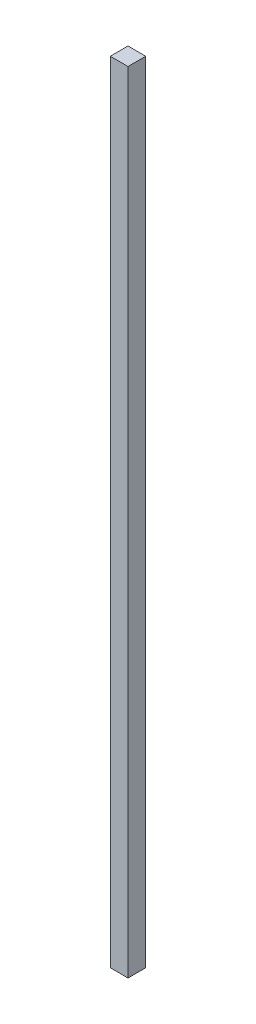
ISO-10303-21;
HEADER;
FILE_DESCRIPTION(('STEP AP214'),'2;1');
FILE_NAME('part.step','',(''),(''),'','','');
FILE_SCHEMA(('AUTOMOTIVE_DESIGN { 1 0 10303 214 1 1 1 1 }'));
ENDSEC;
DATA;
#1=APPLICATION_CONTEXT('core data for automotive mechanical design processes');
#2=APPLICATION_PROTOCOL_DEFINITION('international standard','automotive_design',2000,#1);
#3=PRODUCT_CONTEXT('',#1,'mechanical');
#4=PRODUCT('Part','Part','',(#3));
#5=PRODUCT_RELATED_PRODUCT_CATEGORY('part','',(#4));
#6=PRODUCT_DEFINITION_FORMATION('','',#4);
#7=PRODUCT_DEFINITION_CONTEXT('part definition',#1,'design');
#8=PRODUCT_DEFINITION('design','',#6,#7);
#9=PRODUCT_DEFINITION_SHAPE('','',#8);
#10=(LENGTH_UNIT() NAMED_UNIT(*) SI_UNIT(.MILLI.,.METRE.));
#11=(NAMED_UNIT(*) PLANE_ANGLE_UNIT() SI_UNIT($,.RADIAN.));
#12=(NAMED_UNIT(*) SI_UNIT($,.STERADIAN.) SOLID_ANGLE_UNIT());
#13=UNCERTAINTY_MEASURE_WITH_UNIT(LENGTH_MEASURE(1.E-05),#10,'distance_accuracy_value','');
#14=(GEOMETRIC_REPRESENTATION_CONTEXT(3) GLOBAL_UNCERTAINTY_ASSIGNED_CONTEXT((#13)) GLOBAL_UNIT_ASSIGNED_CONTEXT((#10,
#11,#12)) REPRESENTATION_CONTEXT('',''));
#15=CARTESIAN_POINT('',(0.,0.,0.));
#16=DIRECTION('',(0.,0.,1.));
#17=DIRECTION('',(1.,0.,0.));
#18=AXIS2_PLACEMENT_3D('',#15,#16,#17);
#19=CARTESIAN_POINT('',(3.175,279.4,-3.175));
#20=DIRECTION('',(1.,0.,0.));
#21=DIRECTION('',(0.,0.,-1.));
#22=AXIS2_PLACEMENT_3D('',#19,#20,#21);
#23=PLANE('',#22);
#24=DIRECTION('',(0.,0.,1.));
#25=VECTOR('',#24,1.);
#26=CARTESIAN_POINT('',(3.175,0.,-3.175));
#27=LINE('',#26,#25);
#28=CARTESIAN_POINT('',(3.175,0.,-3.175));
#29=VERTEX_POINT('',#28);
#30=CARTESIAN_POINT('',(3.175,0.,3.175));
#31=VERTEX_POINT('',#30);
#32=EDGE_CURVE('E58',#29,#31,#27,.T.);
#33=ORIENTED_EDGE('',*,*,#32,.F.);
#34=DIRECTION('',(0.,-1.,0.));
#35=VECTOR('',#34,1.);
#36=CARTESIAN_POINT('',(3.175,279.4,-3.175));
#37=LINE('',#36,#35);
#38=CARTESIAN_POINT('',(3.175,282.575,-3.175));
#39=VERTEX_POINT('',#38);
#40=EDGE_CURVE('E33',#39,#29,#37,.T.);
#41=ORIENTED_EDGE('',*,*,#40,.F.);
#42=DIRECTION('',(0.,0.,1.));
#43=VECTOR('',#42,1.);
#44=CARTESIAN_POINT('',(3.175,282.575,-3.175));
#45=LINE('',#44,#43);
#46=CARTESIAN_POINT('',(3.175,282.575,3.175));
#47=VERTEX_POINT('',#46);
#48=EDGE_CURVE('E60',#39,#47,#45,.T.);
#49=ORIENTED_EDGE('',*,*,#48,.T.);
#50=DIRECTION('',(0.,-1.,0.));
#51=VECTOR('',#50,1.);
#52=CARTESIAN_POINT('',(3.175,279.4,3.175));
#53=LINE('',#52,#51);
#54=EDGE_CURVE('E10',#47,#31,#53,.T.);
#55=ORIENTED_EDGE('',*,*,#54,.T.);
#56=EDGE_LOOP('',(#33,#41,#49,#55));
#57=FACE_BOUND('',#56,.T.);
#58=ADVANCED_FACE('F16',(#57),#23,.T.);
#59=CARTESIAN_POINT('',(3.175,279.4,3.175));
#60=DIRECTION('',(0.,0.,1.));
#61=DIRECTION('',(1.,0.,0.));
#62=AXIS2_PLACEMENT_3D('',#59,#60,#61);
#63=PLANE('',#62);
#64=DIRECTION('',(-1.,0.,0.));
#65=VECTOR('',#64,1.);
#66=CARTESIAN_POINT('',(3.175,0.,3.175));
#67=LINE('',#66,#65);
#68=CARTESIAN_POINT('',(-3.175,0.,3.175));
#69=VERTEX_POINT('',#68);
#70=EDGE_CURVE('E65',#31,#69,#67,.T.);
#71=ORIENTED_EDGE('',*,*,#70,.F.);
#72=ORIENTED_EDGE('',*,*,#54,.F.);
#73=DIRECTION('',(-1.,0.,0.));
#74=VECTOR('',#73,1.);
#75=CARTESIAN_POINT('',(3.175,282.575,3.175));
#76=LINE('',#75,#74);
#77=CARTESIAN_POINT('',(-3.175,282.575,3.175));
#78=VERTEX_POINT('',#77);
#79=EDGE_CURVE('E87',#47,#78,#76,.T.);
#80=ORIENTED_EDGE('',*,*,#79,.T.);
#81=DIRECTION('',(0.,-1.,0.));
#82=VECTOR('',#81,1.);
#83=CARTESIAN_POINT('',(-3.175,279.4,3.175));
#84=LINE('',#83,#82);
#85=EDGE_CURVE('E25',#78,#69,#84,.T.);
#86=ORIENTED_EDGE('',*,*,#85,.T.);
#87=EDGE_LOOP('',(#71,#72,#80,#86));
#88=FACE_BOUND('',#87,.T.);
#89=ADVANCED_FACE('F66',(#88),#63,.T.);
#90=CARTESIAN_POINT('',(-3.175,279.4,3.175));
#91=DIRECTION('',(-1.,0.,0.));
#92=DIRECTION('',(0.,0.,1.));
#93=AXIS2_PLACEMENT_3D('',#90,#91,#92);
#94=PLANE('',#93);
#95=DIRECTION('',(0.,0.,-1.));
#96=VECTOR('',#95,1.);
#97=CARTESIAN_POINT('',(-3.175,0.,3.175));
#98=LINE('',#97,#96);
#99=CARTESIAN_POINT('',(-3.175,0.,-3.175));
#100=VERTEX_POINT('',#99);
#101=EDGE_CURVE('E71',#69,#100,#98,.T.);
#102=ORIENTED_EDGE('',*,*,#101,.F.);
#103=ORIENTED_EDGE('',*,*,#85,.F.);
#104=DIRECTION('',(0.,0.,-1.));
#105=VECTOR('',#104,1.);
#106=CARTESIAN_POINT('',(-3.175,282.575,3.175));
#107=LINE('',#106,#105);
#108=CARTESIAN_POINT('',(-3.175,282.575,-3.175));
#109=VERTEX_POINT('',#108);
#110=EDGE_CURVE('E88',#78,#109,#107,.T.);
#111=ORIENTED_EDGE('',*,*,#110,.T.);
#112=DIRECTION('',(0.,-1.,0.));
#113=VECTOR('',#112,1.);
#114=CARTESIAN_POINT('',(-3.175,279.4,-3.175));
#115=LINE('',#114,#113);
#116=EDGE_CURVE('E40',#109,#100,#115,.T.);
#117=ORIENTED_EDGE('',*,*,#116,.T.);
#118=EDGE_LOOP('',(#102,#103,#111,#117));
#119=FACE_BOUND('',#118,.T.);
#120=ADVANCED_FACE('F101',(#119),#94,.T.);
#121=CARTESIAN_POINT('',(-3.175,279.4,-3.175));
#122=DIRECTION('',(0.,0.,-1.));
#123=DIRECTION('',(-1.,0.,0.));
#124=AXIS2_PLACEMENT_3D('',#121,#122,#123);
#125=PLANE('',#124);
#126=DIRECTION('',(1.,0.,0.));
#127=VECTOR('',#126,1.);
#128=CARTESIAN_POINT('',(-3.175,0.,-3.175));
#129=LINE('',#128,#127);
#130=EDGE_CURVE('E75',#100,#29,#129,.T.);
#131=ORIENTED_EDGE('',*,*,#130,.F.);
#132=ORIENTED_EDGE('',*,*,#116,.F.);
#133=DIRECTION('',(1.,0.,0.));
#134=VECTOR('',#133,1.);
#135=CARTESIAN_POINT('',(-3.175,282.575,-3.175));
#136=LINE('',#135,#134);
#137=EDGE_CURVE('E20',#109,#39,#136,.T.);
#138=ORIENTED_EDGE('',*,*,#137,.T.);
#139=ORIENTED_EDGE('',*,*,#40,.T.);
#140=EDGE_LOOP('',(#131,#132,#138,#139));
#141=FACE_BOUND('',#140,.T.);
#142=ADVANCED_FACE('F92',(#141),#125,.T.);
#143=CARTESIAN_POINT('',(0.,282.575,0.));
#144=DIRECTION('',(0.,-1.,0.));
#145=DIRECTION('',(0.,0.,-1.));
#146=AXIS2_PLACEMENT_3D('',#143,#144,#145);
#147=PLANE('',#146);
#148=ORIENTED_EDGE('',*,*,#48,.F.);
#149=ORIENTED_EDGE('',*,*,#137,.F.);
#150=ORIENTED_EDGE('',*,*,#110,.F.);
#151=ORIENTED_EDGE('',*,*,#79,.F.);
#152=EDGE_LOOP('',(#148,#149,#150,#151));
#153=FACE_BOUND('',#152,.T.);
#154=ADVANCED_FACE('F18',(#153),#147,.F.);
#155=CARTESIAN_POINT('',(0.,0.,0.));
#156=DIRECTION('',(0.,-1.,0.));
#157=DIRECTION('',(0.,0.,-1.));
#158=AXIS2_PLACEMENT_3D('',#155,#156,#157);
#159=PLANE('',#158);
#160=ORIENTED_EDGE('',*,*,#32,.T.);
#161=ORIENTED_EDGE('',*,*,#70,.T.);
#162=ORIENTED_EDGE('',*,*,#101,.T.);
#163=ORIENTED_EDGE('',*,*,#130,.T.);
#164=EDGE_LOOP('',(#160,#161,#162,#163));
#165=FACE_BOUND('',#164,.T.);
#166=ADVANCED_FACE('F74',(#165),#159,.T.);
#167=CLOSED_SHELL('',(#58,#89,#120,#142,#154,#166));
#168=MANIFOLD_SOLID_BREP('B1',#167);
#169=ADVANCED_BREP_SHAPE_REPRESENTATION('',(#18,#168),#14);
#170=SHAPE_DEFINITION_REPRESENTATION(#9,#169);
ENDSEC;
END-ISO-10303-21;
